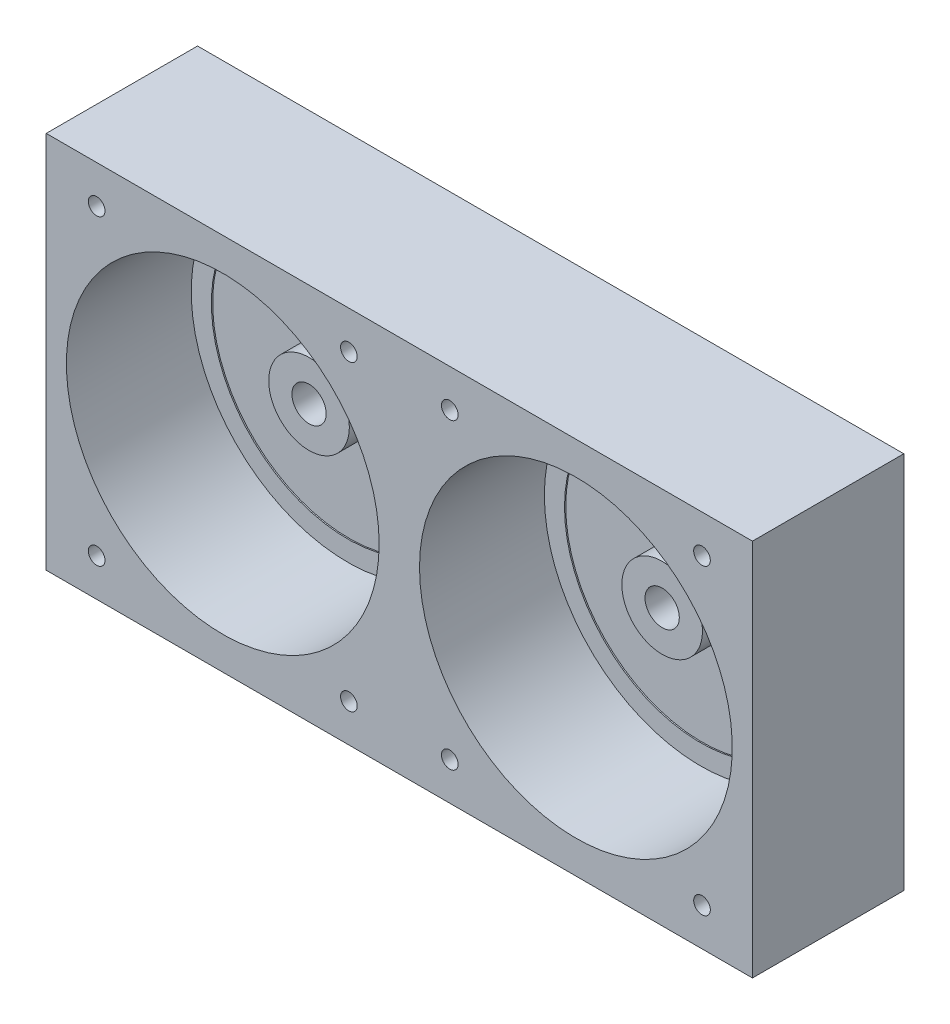
ISO-10303-21;
HEADER;
FILE_DESCRIPTION(('STEP AP214'),'2;1');
FILE_NAME('part.step','',(''),(''),'','','');
FILE_SCHEMA(('AUTOMOTIVE_DESIGN { 1 0 10303 214 1 1 1 1 }'));
ENDSEC;
DATA;
#1=APPLICATION_CONTEXT('core data for automotive mechanical design processes');
#2=APPLICATION_PROTOCOL_DEFINITION('international standard','automotive_design',2000,#1);
#3=PRODUCT_CONTEXT('',#1,'mechanical');
#4=PRODUCT('Part','Part','',(#3));
#5=PRODUCT_RELATED_PRODUCT_CATEGORY('part','',(#4));
#6=PRODUCT_DEFINITION_FORMATION('','',#4);
#7=PRODUCT_DEFINITION_CONTEXT('part definition',#1,'design');
#8=PRODUCT_DEFINITION('design','',#6,#7);
#9=PRODUCT_DEFINITION_SHAPE('','',#8);
#10=(LENGTH_UNIT() NAMED_UNIT(*) SI_UNIT(.MILLI.,.METRE.));
#11=(NAMED_UNIT(*) PLANE_ANGLE_UNIT() SI_UNIT($,.RADIAN.));
#12=(NAMED_UNIT(*) SI_UNIT($,.STERADIAN.) SOLID_ANGLE_UNIT());
#13=UNCERTAINTY_MEASURE_WITH_UNIT(LENGTH_MEASURE(1.E-05),#10,'distance_accuracy_value','');
#14=(GEOMETRIC_REPRESENTATION_CONTEXT(3) GLOBAL_UNCERTAINTY_ASSIGNED_CONTEXT((#13)) GLOBAL_UNIT_ASSIGNED_CONTEXT((#10,
#11,#12)) REPRESENTATION_CONTEXT('',''));
#15=CARTESIAN_POINT('',(0.,0.,0.));
#16=DIRECTION('',(0.,0.,1.));
#17=DIRECTION('',(1.,0.,0.));
#18=AXIS2_PLACEMENT_3D('',#15,#16,#17);
#19=CARTESIAN_POINT('',(105.,37.5,5.));
#20=DIRECTION('',(0.,0.,-1.));
#21=DIRECTION('',(-1.,0.,0.));
#22=AXIS2_PLACEMENT_3D('',#19,#20,#21);
#23=PLANE('',#22);
#24=CARTESIAN_POINT('',(105.,37.5,5.));
#25=DIRECTION('',(0.,0.,1.));
#26=DIRECTION('',(-1.,0.,0.));
#27=AXIS2_PLACEMENT_3D('',#24,#25,#26);
#28=CIRCLE('',#27,27.01);
#29=CARTESIAN_POINT('',(77.99,37.5,5.));
#30=VERTEX_POINT('',#29);
#31=EDGE_CURVE('E306',#30,#30,#28,.T.);
#32=ORIENTED_EDGE('',*,*,#31,.T.);
#33=EDGE_LOOP('',(#32));
#34=FACE_BOUND('',#33,.T.);
#35=CARTESIAN_POINT('',(105.,37.5,5.));
#36=DIRECTION('',(0.,0.,-1.));
#37=DIRECTION('',(-1.,0.,0.));
#38=AXIS2_PLACEMENT_3D('',#35,#36,#37);
#39=CIRCLE('',#38,7.99);
#40=CARTESIAN_POINT('',(97.01,37.5,5.));
#41=VERTEX_POINT('',#40);
#42=EDGE_CURVE('E11',#41,#41,#39,.F.);
#43=ORIENTED_EDGE('',*,*,#42,.F.);
#44=EDGE_LOOP('',(#43));
#45=FACE_BOUND('',#44,.T.);
#46=ADVANCED_FACE('F32',(#34,#45),#23,.F.);
#47=CARTESIAN_POINT('',(35.,37.5,5.));
#48=DIRECTION('',(0.,0.,1.));
#49=DIRECTION('',(1.,0.,0.));
#50=AXIS2_PLACEMENT_3D('',#47,#48,#49);
#51=PLANE('',#50);
#52=CARTESIAN_POINT('',(35.,37.5,5.));
#53=DIRECTION('',(0.,0.,1.));
#54=DIRECTION('',(1.,0.,0.));
#55=AXIS2_PLACEMENT_3D('',#52,#53,#54);
#56=CIRCLE('',#55,27.01);
#57=CARTESIAN_POINT('',(62.01,37.5,5.));
#58=VERTEX_POINT('',#57);
#59=EDGE_CURVE('E110',#58,#58,#56,.F.);
#60=ORIENTED_EDGE('',*,*,#59,.F.);
#61=EDGE_LOOP('',(#60));
#62=FACE_BOUND('',#61,.T.);
#63=CARTESIAN_POINT('',(35.,37.5,5.));
#64=DIRECTION('',(0.,0.,1.));
#65=DIRECTION('',(1.,0.,0.));
#66=AXIS2_PLACEMENT_3D('',#63,#64,#65);
#67=CIRCLE('',#66,7.98999999999999);
#68=CARTESIAN_POINT('',(42.99,37.5,5.));
#69=VERTEX_POINT('',#68);
#70=EDGE_CURVE('E302',#69,#69,#67,.T.);
#71=ORIENTED_EDGE('',*,*,#70,.F.);
#72=EDGE_LOOP('',(#71));
#73=FACE_BOUND('',#72,.T.);
#74=ADVANCED_FACE('F120',(#62,#73),#51,.T.);
#75=CARTESIAN_POINT('',(105.,37.5,5.));
#76=DIRECTION('',(0.,0.,1.));
#77=DIRECTION('',(1.,0.,0.));
#78=AXIS2_PLACEMENT_3D('',#75,#76,#77);
#79=CYLINDRICAL_SURFACE('',#78,31.);
#80=CARTESIAN_POINT('',(105.,37.5,30.));
#81=DIRECTION('',(0.,0.,1.));
#82=DIRECTION('',(-1.,0.,0.));
#83=AXIS2_PLACEMENT_3D('',#80,#81,#82);
#84=CIRCLE('',#83,31.);
#85=CARTESIAN_POINT('',(74.,37.5,30.));
#86=VERTEX_POINT('',#85);
#87=EDGE_CURVE('E325',#86,#86,#84,.T.);
#88=ORIENTED_EDGE('',*,*,#87,.T.);
#89=EDGE_LOOP('',(#88));
#90=FACE_BOUND('',#89,.T.);
#91=CARTESIAN_POINT('',(105.,37.5,5.25));
#92=DIRECTION('',(0.,0.,-1.));
#93=DIRECTION('',(-1.,0.,0.));
#94=AXIS2_PLACEMENT_3D('',#91,#92,#93);
#95=CIRCLE('',#94,31.);
#96=CARTESIAN_POINT('',(74.,37.5,5.25));
#97=VERTEX_POINT('',#96);
#98=EDGE_CURVE('E41',#97,#97,#95,.F.);
#99=ORIENTED_EDGE('',*,*,#98,.F.);
#100=EDGE_LOOP('',(#99));
#101=FACE_BOUND('',#100,.T.);
#102=ADVANCED_FACE('F118',(#90,#101),#79,.F.);
#103=CARTESIAN_POINT('',(0.,0.,30.));
#104=DIRECTION('',(1.,0.,0.));
#105=DIRECTION('',(0.,0.,-1.));
#106=AXIS2_PLACEMENT_3D('',#103,#104,#105);
#107=PLANE('',#106);
#108=DIRECTION('',(0.,-1.,0.));
#109=VECTOR('',#108,1.);
#110=CARTESIAN_POINT('',(0.,0.,0.));
#111=LINE('',#110,#109);
#112=CARTESIAN_POINT('',(0.,75.,0.));
#113=VERTEX_POINT('',#112);
#114=CARTESIAN_POINT('',(0.,0.,0.));
#115=VERTEX_POINT('',#114);
#116=EDGE_CURVE('E100',#113,#115,#111,.T.);
#117=ORIENTED_EDGE('',*,*,#116,.T.);
#118=DIRECTION('',(0.,0.,-1.));
#119=VECTOR('',#118,1.);
#120=CARTESIAN_POINT('',(0.,0.,30.));
#121=LINE('',#120,#119);
#122=CARTESIAN_POINT('',(0.,0.,30.));
#123=VERTEX_POINT('',#122);
#124=EDGE_CURVE('E91',#123,#115,#121,.T.);
#125=ORIENTED_EDGE('',*,*,#124,.F.);
#126=DIRECTION('',(0.,-1.,0.));
#127=VECTOR('',#126,1.);
#128=CARTESIAN_POINT('',(0.,0.,30.));
#129=LINE('',#128,#127);
#130=CARTESIAN_POINT('',(0.,75.,30.));
#131=VERTEX_POINT('',#130);
#132=EDGE_CURVE('E85',#131,#123,#129,.T.);
#133=ORIENTED_EDGE('',*,*,#132,.F.);
#134=DIRECTION('',(0.,0.,-1.));
#135=VECTOR('',#134,1.);
#136=CARTESIAN_POINT('',(0.,75.,30.));
#137=LINE('',#136,#135);
#138=EDGE_CURVE('E96',#131,#113,#137,.T.);
#139=ORIENTED_EDGE('',*,*,#138,.T.);
#140=EDGE_LOOP('',(#117,#125,#133,#139));
#141=FACE_BOUND('',#140,.T.);
#142=ADVANCED_FACE('F34',(#141),#107,.F.);
#143=CARTESIAN_POINT('',(0.,0.,30.));
#144=DIRECTION('',(0.,1.,0.));
#145=DIRECTION('',(0.,0.,1.));
#146=AXIS2_PLACEMENT_3D('',#143,#144,#145);
#147=PLANE('',#146);
#148=DIRECTION('',(1.,0.,0.));
#149=VECTOR('',#148,1.);
#150=CARTESIAN_POINT('',(0.,0.,0.));
#151=LINE('',#150,#149);
#152=CARTESIAN_POINT('',(140.,0.,0.));
#153=VERTEX_POINT('',#152);
#154=EDGE_CURVE('E90',#115,#153,#151,.T.);
#155=ORIENTED_EDGE('',*,*,#154,.T.);
#156=DIRECTION('',(0.,0.,-1.));
#157=VECTOR('',#156,1.);
#158=CARTESIAN_POINT('',(140.,0.,30.));
#159=LINE('',#158,#157);
#160=CARTESIAN_POINT('',(140.,0.,30.));
#161=VERTEX_POINT('',#160);
#162=EDGE_CURVE('E88',#161,#153,#159,.T.);
#163=ORIENTED_EDGE('',*,*,#162,.F.);
#164=DIRECTION('',(1.,0.,0.));
#165=VECTOR('',#164,1.);
#166=CARTESIAN_POINT('',(0.,0.,30.));
#167=LINE('',#166,#165);
#168=EDGE_CURVE('E80',#123,#161,#167,.T.);
#169=ORIENTED_EDGE('',*,*,#168,.F.);
#170=ORIENTED_EDGE('',*,*,#124,.T.);
#171=EDGE_LOOP('',(#155,#163,#169,#170));
#172=FACE_BOUND('',#171,.T.);
#173=ADVANCED_FACE('F89',(#172),#147,.F.);
#174=CARTESIAN_POINT('',(140.,0.,30.));
#175=DIRECTION('',(-1.,0.,0.));
#176=DIRECTION('',(0.,0.,1.));
#177=AXIS2_PLACEMENT_3D('',#174,#175,#176);
#178=PLANE('',#177);
#179=DIRECTION('',(0.,1.,0.));
#180=VECTOR('',#179,1.);
#181=CARTESIAN_POINT('',(140.,0.,0.));
#182=LINE('',#181,#180);
#183=CARTESIAN_POINT('',(140.,75.,0.));
#184=VERTEX_POINT('',#183);
#185=EDGE_CURVE('E66',#153,#184,#182,.T.);
#186=ORIENTED_EDGE('',*,*,#185,.T.);
#187=DIRECTION('',(0.,0.,-1.));
#188=VECTOR('',#187,1.);
#189=CARTESIAN_POINT('',(140.,75.,30.));
#190=LINE('',#189,#188);
#191=CARTESIAN_POINT('',(140.,75.,30.));
#192=VERTEX_POINT('',#191);
#193=EDGE_CURVE('E92',#192,#184,#190,.T.);
#194=ORIENTED_EDGE('',*,*,#193,.F.);
#195=DIRECTION('',(0.,1.,0.));
#196=VECTOR('',#195,1.);
#197=CARTESIAN_POINT('',(140.,0.,30.));
#198=LINE('',#197,#196);
#199=EDGE_CURVE('E83',#161,#192,#198,.T.);
#200=ORIENTED_EDGE('',*,*,#199,.F.);
#201=ORIENTED_EDGE('',*,*,#162,.T.);
#202=EDGE_LOOP('',(#186,#194,#200,#201));
#203=FACE_BOUND('',#202,.T.);
#204=ADVANCED_FACE('F94',(#203),#178,.F.);
#205=CARTESIAN_POINT('',(0.,75.,30.));
#206=DIRECTION('',(0.,-1.,0.));
#207=DIRECTION('',(0.,0.,-1.));
#208=AXIS2_PLACEMENT_3D('',#205,#206,#207);
#209=PLANE('',#208);
#210=DIRECTION('',(-1.,0.,0.));
#211=VECTOR('',#210,1.);
#212=CARTESIAN_POINT('',(0.,75.,0.));
#213=LINE('',#212,#211);
#214=EDGE_CURVE('E72',#184,#113,#213,.T.);
#215=ORIENTED_EDGE('',*,*,#214,.T.);
#216=ORIENTED_EDGE('',*,*,#138,.F.);
#217=DIRECTION('',(-1.,0.,0.));
#218=VECTOR('',#217,1.);
#219=CARTESIAN_POINT('',(0.,75.,30.));
#220=LINE('',#219,#218);
#221=EDGE_CURVE('E49',#192,#131,#220,.T.);
#222=ORIENTED_EDGE('',*,*,#221,.F.);
#223=ORIENTED_EDGE('',*,*,#193,.T.);
#224=EDGE_LOOP('',(#215,#216,#222,#223));
#225=FACE_BOUND('',#224,.T.);
#226=ADVANCED_FACE('F333',(#225),#209,.F.);
#227=CARTESIAN_POINT('',(0.,0.,30.));
#228=DIRECTION('',(0.,0.,-1.));
#229=DIRECTION('',(-1.,0.,0.));
#230=AXIS2_PLACEMENT_3D('',#227,#228,#229);
#231=PLANE('',#230);
#232=CARTESIAN_POINT('',(10.,67.5,30.));
#233=DIRECTION('',(0.,0.,1.));
#234=DIRECTION('',(1.,0.,0.));
#235=AXIS2_PLACEMENT_3D('',#232,#233,#234);
#236=CIRCLE('',#235,1.65);
#237=CARTESIAN_POINT('',(11.65,67.5,30.));
#238=VERTEX_POINT('',#237);
#239=EDGE_CURVE('E247',#238,#238,#236,.T.);
#240=ORIENTED_EDGE('',*,*,#239,.F.);
#241=EDGE_LOOP('',(#240));
#242=FACE_BOUND('',#241,.T.);
#243=CARTESIAN_POINT('',(10.,7.49999999999999,30.));
#244=DIRECTION('',(0.,0.,1.));
#245=DIRECTION('',(-1.,0.,0.));
#246=AXIS2_PLACEMENT_3D('',#243,#244,#245);
#247=CIRCLE('',#246,1.65);
#248=CARTESIAN_POINT('',(8.35000000000001,7.49999999999999,30.));
#249=VERTEX_POINT('',#248);
#250=EDGE_CURVE('E258',#249,#249,#247,.T.);
#251=ORIENTED_EDGE('',*,*,#250,.F.);
#252=EDGE_LOOP('',(#251));
#253=FACE_BOUND('',#252,.T.);
#254=CARTESIAN_POINT('',(60.,7.49999999999999,30.));
#255=DIRECTION('',(0.,0.,1.));
#256=DIRECTION('',(-1.,0.,0.));
#257=AXIS2_PLACEMENT_3D('',#254,#255,#256);
#258=CIRCLE('',#257,1.65);
#259=CARTESIAN_POINT('',(58.35,7.49999999999999,30.));
#260=VERTEX_POINT('',#259);
#261=EDGE_CURVE('E264',#260,#260,#258,.T.);
#262=ORIENTED_EDGE('',*,*,#261,.F.);
#263=EDGE_LOOP('',(#262));
#264=FACE_BOUND('',#263,.T.);
#265=CARTESIAN_POINT('',(80.,7.49999999999999,30.));
#266=DIRECTION('',(0.,0.,1.));
#267=DIRECTION('',(1.,0.,0.));
#268=AXIS2_PLACEMENT_3D('',#265,#266,#267);
#269=CIRCLE('',#268,1.65);
#270=CARTESIAN_POINT('',(81.65,7.49999999999999,30.));
#271=VERTEX_POINT('',#270);
#272=EDGE_CURVE('E270',#271,#271,#269,.T.);
#273=ORIENTED_EDGE('',*,*,#272,.F.);
#274=EDGE_LOOP('',(#273));
#275=FACE_BOUND('',#274,.T.);
#276=CARTESIAN_POINT('',(130.,7.49999999999999,30.));
#277=DIRECTION('',(0.,0.,1.));
#278=DIRECTION('',(1.,0.,0.));
#279=AXIS2_PLACEMENT_3D('',#276,#277,#278);
#280=CIRCLE('',#279,1.65000000000002);
#281=CARTESIAN_POINT('',(131.65,7.49999999999999,30.));
#282=VERTEX_POINT('',#281);
#283=EDGE_CURVE('E276',#282,#282,#280,.T.);
#284=ORIENTED_EDGE('',*,*,#283,.F.);
#285=EDGE_LOOP('',(#284));
#286=FACE_BOUND('',#285,.T.);
#287=CARTESIAN_POINT('',(130.,67.5,30.));
#288=DIRECTION('',(0.,0.,1.));
#289=DIRECTION('',(-1.,0.,0.));
#290=AXIS2_PLACEMENT_3D('',#287,#288,#289);
#291=CIRCLE('',#290,1.65000000000002);
#292=CARTESIAN_POINT('',(128.35,67.5,30.));
#293=VERTEX_POINT('',#292);
#294=EDGE_CURVE('E282',#293,#293,#291,.T.);
#295=ORIENTED_EDGE('',*,*,#294,.F.);
#296=EDGE_LOOP('',(#295));
#297=FACE_BOUND('',#296,.T.);
#298=CARTESIAN_POINT('',(80.,67.5,30.));
#299=DIRECTION('',(0.,0.,1.));
#300=DIRECTION('',(-1.,0.,0.));
#301=AXIS2_PLACEMENT_3D('',#298,#299,#300);
#302=CIRCLE('',#301,1.65);
#303=CARTESIAN_POINT('',(78.35,67.5,30.));
#304=VERTEX_POINT('',#303);
#305=EDGE_CURVE('E288',#304,#304,#302,.T.);
#306=ORIENTED_EDGE('',*,*,#305,.F.);
#307=EDGE_LOOP('',(#306));
#308=FACE_BOUND('',#307,.T.);
#309=CARTESIAN_POINT('',(60.,67.5,30.));
#310=DIRECTION('',(0.,0.,1.));
#311=DIRECTION('',(1.,0.,0.));
#312=AXIS2_PLACEMENT_3D('',#309,#310,#311);
#313=CIRCLE('',#312,1.65);
#314=CARTESIAN_POINT('',(61.65,67.5,30.));
#315=VERTEX_POINT('',#314);
#316=EDGE_CURVE('E246',#315,#315,#313,.T.);
#317=ORIENTED_EDGE('',*,*,#316,.F.);
#318=EDGE_LOOP('',(#317));
#319=FACE_BOUND('',#318,.T.);
#320=ORIENTED_EDGE('',*,*,#87,.F.);
#321=EDGE_LOOP('',(#320));
#322=FACE_BOUND('',#321,.T.);
#323=CARTESIAN_POINT('',(35.,37.5,30.));
#324=DIRECTION('',(0.,0.,1.));
#325=DIRECTION('',(1.,0.,0.));
#326=AXIS2_PLACEMENT_3D('',#323,#324,#325);
#327=CIRCLE('',#326,31.);
#328=CARTESIAN_POINT('',(66.,37.5,30.));
#329=VERTEX_POINT('',#328);
#330=EDGE_CURVE('E103',#329,#329,#327,.T.);
#331=ORIENTED_EDGE('',*,*,#330,.F.);
#332=EDGE_LOOP('',(#331));
#333=FACE_BOUND('',#332,.T.);
#334=ORIENTED_EDGE('',*,*,#132,.T.);
#335=ORIENTED_EDGE('',*,*,#168,.T.);
#336=ORIENTED_EDGE('',*,*,#199,.T.);
#337=ORIENTED_EDGE('',*,*,#221,.T.);
#338=EDGE_LOOP('',(#334,#335,#336,#337));
#339=FACE_BOUND('',#338,.T.);
#340=ADVANCED_FACE('F81',(#242,#253,#264,#275,#286,#297,#308,#319,#322,#333,#339),#231,.F.);
#341=CARTESIAN_POINT('',(0.,0.,0.));
#342=DIRECTION('',(0.,0.,-1.));
#343=DIRECTION('',(-1.,0.,0.));
#344=AXIS2_PLACEMENT_3D('',#341,#342,#343);
#345=PLANE('',#344);
#346=CARTESIAN_POINT('',(105.,37.5,0.));
#347=DIRECTION('',(0.,0.,1.));
#348=DIRECTION('',(-1.,0.,0.));
#349=AXIS2_PLACEMENT_3D('',#346,#347,#348);
#350=CIRCLE('',#349,3.4);
#351=CARTESIAN_POINT('',(101.6,37.5,0.));
#352=VERTEX_POINT('',#351);
#353=EDGE_CURVE('E319',#352,#352,#350,.T.);
#354=ORIENTED_EDGE('',*,*,#353,.T.);
#355=EDGE_LOOP('',(#354));
#356=FACE_BOUND('',#355,.T.);
#357=CARTESIAN_POINT('',(35.,37.5,0.));
#358=DIRECTION('',(0.,0.,1.));
#359=DIRECTION('',(1.,0.,0.));
#360=AXIS2_PLACEMENT_3D('',#357,#358,#359);
#361=CIRCLE('',#360,3.4);
#362=CARTESIAN_POINT('',(38.4,37.5,0.));
#363=VERTEX_POINT('',#362);
#364=EDGE_CURVE('E322',#363,#363,#361,.T.);
#365=ORIENTED_EDGE('',*,*,#364,.T.);
#366=EDGE_LOOP('',(#365));
#367=FACE_BOUND('',#366,.T.);
#368=ORIENTED_EDGE('',*,*,#116,.F.);
#369=ORIENTED_EDGE('',*,*,#214,.F.);
#370=ORIENTED_EDGE('',*,*,#185,.F.);
#371=ORIENTED_EDGE('',*,*,#154,.F.);
#372=EDGE_LOOP('',(#368,#369,#370,#371));
#373=FACE_BOUND('',#372,.T.);
#374=ADVANCED_FACE('F332',(#356,#367,#373),#345,.T.);
#375=CARTESIAN_POINT('',(35.,37.5,5.));
#376=DIRECTION('',(0.,0.,1.));
#377=DIRECTION('',(1.,0.,0.));
#378=AXIS2_PLACEMENT_3D('',#375,#376,#377);
#379=CYLINDRICAL_SURFACE('',#378,31.);
#380=CARTESIAN_POINT('',(35.,37.5,5.25));
#381=DIRECTION('',(0.,0.,1.));
#382=DIRECTION('',(1.,0.,0.));
#383=AXIS2_PLACEMENT_3D('',#380,#381,#382);
#384=CIRCLE('',#383,31.);
#385=CARTESIAN_POINT('',(66.,37.5,5.25));
#386=VERTEX_POINT('',#385);
#387=EDGE_CURVE('E316',#386,#386,#384,.T.);
#388=ORIENTED_EDGE('',*,*,#387,.F.);
#389=EDGE_LOOP('',(#388));
#390=FACE_BOUND('',#389,.T.);
#391=ORIENTED_EDGE('',*,*,#330,.T.);
#392=EDGE_LOOP('',(#391));
#393=FACE_BOUND('',#392,.T.);
#394=ADVANCED_FACE('F143',(#390,#393),#379,.F.);
#395=CARTESIAN_POINT('',(35.,37.5,0.));
#396=DIRECTION('',(0.,0.,1.));
#397=DIRECTION('',(1.,0.,0.));
#398=AXIS2_PLACEMENT_3D('',#395,#396,#397);
#399=CYLINDRICAL_SURFACE('',#398,3.4);
#400=ORIENTED_EDGE('',*,*,#364,.F.);
#401=EDGE_LOOP('',(#400));
#402=FACE_BOUND('',#401,.T.);
#403=CARTESIAN_POINT('',(35.,37.5,12.9));
#404=DIRECTION('',(0.,0.,1.));
#405=DIRECTION('',(1.,0.,0.));
#406=AXIS2_PLACEMENT_3D('',#403,#404,#405);
#407=CIRCLE('',#406,3.4);
#408=CARTESIAN_POINT('',(38.4,37.5,12.9));
#409=VERTEX_POINT('',#408);
#410=EDGE_CURVE('E299',#409,#409,#407,.T.);
#411=ORIENTED_EDGE('',*,*,#410,.T.);
#412=EDGE_LOOP('',(#411));
#413=FACE_BOUND('',#412,.T.);
#414=ADVANCED_FACE('F139',(#402,#413),#399,.F.);
#415=CARTESIAN_POINT('',(105.,37.5,0.));
#416=DIRECTION('',(0.,0.,1.));
#417=DIRECTION('',(1.,0.,0.));
#418=AXIS2_PLACEMENT_3D('',#415,#416,#417);
#419=CYLINDRICAL_SURFACE('',#418,3.4);
#420=ORIENTED_EDGE('',*,*,#353,.F.);
#421=EDGE_LOOP('',(#420));
#422=FACE_BOUND('',#421,.T.);
#423=CARTESIAN_POINT('',(105.,37.5,12.9));
#424=DIRECTION('',(0.,0.,1.));
#425=DIRECTION('',(1.,0.,0.));
#426=AXIS2_PLACEMENT_3D('',#423,#424,#425);
#427=CIRCLE('',#426,3.4);
#428=CARTESIAN_POINT('',(108.4,37.5,12.9));
#429=VERTEX_POINT('',#428);
#430=EDGE_CURVE('E292',#429,#429,#427,.T.);
#431=ORIENTED_EDGE('',*,*,#430,.T.);
#432=EDGE_LOOP('',(#431));
#433=FACE_BOUND('',#432,.T.);
#434=ADVANCED_FACE('F142',(#422,#433),#419,.F.);
#435=CARTESIAN_POINT('',(35.,37.5,5.25));
#436=DIRECTION('',(0.,0.,1.));
#437=DIRECTION('',(1.,0.,0.));
#438=AXIS2_PLACEMENT_3D('',#435,#436,#437);
#439=PLANE('',#438);
#440=ORIENTED_EDGE('',*,*,#387,.T.);
#441=EDGE_LOOP('',(#440));
#442=FACE_BOUND('',#441,.T.);
#443=CARTESIAN_POINT('',(35.,37.5,5.25));
#444=DIRECTION('',(0.,0.,1.));
#445=DIRECTION('',(1.,0.,0.));
#446=AXIS2_PLACEMENT_3D('',#443,#444,#445);
#447=CIRCLE('',#446,27.01);
#448=CARTESIAN_POINT('',(62.01,37.5,5.25));
#449=VERTEX_POINT('',#448);
#450=EDGE_CURVE('E312',#449,#449,#447,.T.);
#451=ORIENTED_EDGE('',*,*,#450,.F.);
#452=EDGE_LOOP('',(#451));
#453=FACE_BOUND('',#452,.T.);
#454=ADVANCED_FACE('F147',(#442,#453),#439,.T.);
#455=CARTESIAN_POINT('',(35.,37.5,5.25));
#456=DIRECTION('',(0.,0.,-1.));
#457=DIRECTION('',(-1.,0.,0.));
#458=AXIS2_PLACEMENT_3D('',#455,#456,#457);
#459=CYLINDRICAL_SURFACE('',#458,27.01);
#460=ORIENTED_EDGE('',*,*,#450,.T.);
#461=EDGE_LOOP('',(#460));
#462=FACE_BOUND('',#461,.T.);
#463=ORIENTED_EDGE('',*,*,#59,.T.);
#464=EDGE_LOOP('',(#463));
#465=FACE_BOUND('',#464,.T.);
#466=ADVANCED_FACE('F151',(#462,#465),#459,.F.);
#467=CARTESIAN_POINT('',(105.,37.5,5.25));
#468=DIRECTION('',(0.,0.,-1.));
#469=DIRECTION('',(-1.,0.,0.));
#470=AXIS2_PLACEMENT_3D('',#467,#468,#469);
#471=PLANE('',#470);
#472=ORIENTED_EDGE('',*,*,#98,.T.);
#473=EDGE_LOOP('',(#472));
#474=FACE_BOUND('',#473,.T.);
#475=CARTESIAN_POINT('',(105.,37.5,5.25));
#476=DIRECTION('',(0.,0.,1.));
#477=DIRECTION('',(-1.,0.,0.));
#478=AXIS2_PLACEMENT_3D('',#475,#476,#477);
#479=CIRCLE('',#478,27.01);
#480=CARTESIAN_POINT('',(77.99,37.5,5.25));
#481=VERTEX_POINT('',#480);
#482=EDGE_CURVE('E309',#481,#481,#479,.T.);
#483=ORIENTED_EDGE('',*,*,#482,.F.);
#484=EDGE_LOOP('',(#483));
#485=FACE_BOUND('',#484,.T.);
#486=ADVANCED_FACE('F115',(#474,#485),#471,.F.);
#487=CARTESIAN_POINT('',(105.,37.5,5.25));
#488=DIRECTION('',(0.,0.,-1.));
#489=DIRECTION('',(-1.,0.,0.));
#490=AXIS2_PLACEMENT_3D('',#487,#488,#489);
#491=CYLINDRICAL_SURFACE('',#490,27.01);
#492=ORIENTED_EDGE('',*,*,#482,.T.);
#493=EDGE_LOOP('',(#492));
#494=FACE_BOUND('',#493,.T.);
#495=ORIENTED_EDGE('',*,*,#31,.F.);
#496=EDGE_LOOP('',(#495));
#497=FACE_BOUND('',#496,.T.);
#498=ADVANCED_FACE('F158',(#494,#497),#491,.F.);
#499=CARTESIAN_POINT('',(35.,37.5,12.9));
#500=DIRECTION('',(0.,0.,1.));
#501=DIRECTION('',(1.,0.,0.));
#502=AXIS2_PLACEMENT_3D('',#499,#500,#501);
#503=PLANE('',#502);
#504=CARTESIAN_POINT('',(35.,37.5,12.9));
#505=DIRECTION('',(0.,0.,1.));
#506=DIRECTION('',(1.,0.,0.));
#507=AXIS2_PLACEMENT_3D('',#504,#505,#506);
#508=CIRCLE('',#507,7.98999999999999);
#509=CARTESIAN_POINT('',(42.99,37.5,12.9));
#510=VERTEX_POINT('',#509);
#511=EDGE_CURVE('E303',#510,#510,#508,.T.);
#512=ORIENTED_EDGE('',*,*,#511,.T.);
#513=EDGE_LOOP('',(#512));
#514=FACE_BOUND('',#513,.T.);
#515=ORIENTED_EDGE('',*,*,#410,.F.);
#516=EDGE_LOOP('',(#515));
#517=FACE_BOUND('',#516,.T.);
#518=ADVANCED_FACE('F161',(#514,#517),#503,.T.);
#519=CARTESIAN_POINT('',(35.,37.5,12.9));
#520=DIRECTION('',(0.,0.,-1.));
#521=DIRECTION('',(-1.,0.,0.));
#522=AXIS2_PLACEMENT_3D('',#519,#520,#521);
#523=CYLINDRICAL_SURFACE('',#522,7.98999999999999);
#524=ORIENTED_EDGE('',*,*,#511,.F.);
#525=EDGE_LOOP('',(#524));
#526=FACE_BOUND('',#525,.T.);
#527=ORIENTED_EDGE('',*,*,#70,.T.);
#528=EDGE_LOOP('',(#527));
#529=FACE_BOUND('',#528,.T.);
#530=ADVANCED_FACE('F163',(#526,#529),#523,.T.);
#531=CARTESIAN_POINT('',(105.,37.5,12.9));
#532=DIRECTION('',(0.,0.,1.));
#533=DIRECTION('',(1.,0.,0.));
#534=AXIS2_PLACEMENT_3D('',#531,#532,#533);
#535=PLANE('',#534);
#536=CARTESIAN_POINT('',(105.,37.5,12.9));
#537=DIRECTION('',(0.,0.,1.));
#538=DIRECTION('',(1.,0.,0.));
#539=AXIS2_PLACEMENT_3D('',#536,#537,#538);
#540=CIRCLE('',#539,7.99);
#541=CARTESIAN_POINT('',(112.99,37.5,12.9));
#542=VERTEX_POINT('',#541);
#543=EDGE_CURVE('E296',#542,#542,#540,.T.);
#544=ORIENTED_EDGE('',*,*,#543,.T.);
#545=EDGE_LOOP('',(#544));
#546=FACE_BOUND('',#545,.T.);
#547=ORIENTED_EDGE('',*,*,#430,.F.);
#548=EDGE_LOOP('',(#547));
#549=FACE_BOUND('',#548,.T.);
#550=ADVANCED_FACE('F166',(#546,#549),#535,.T.);
#551=CARTESIAN_POINT('',(105.,37.5,12.9));
#552=DIRECTION('',(0.,0.,-1.));
#553=DIRECTION('',(-1.,0.,0.));
#554=AXIS2_PLACEMENT_3D('',#551,#552,#553);
#555=CYLINDRICAL_SURFACE('',#554,7.99);
#556=ORIENTED_EDGE('',*,*,#543,.F.);
#557=EDGE_LOOP('',(#556));
#558=FACE_BOUND('',#557,.T.);
#559=ORIENTED_EDGE('',*,*,#42,.T.);
#560=EDGE_LOOP('',(#559));
#561=FACE_BOUND('',#560,.T.);
#562=ADVANCED_FACE('F171',(#558,#561),#555,.T.);
#563=CARTESIAN_POINT('',(60.,67.5,10.));
#564=DIRECTION('',(0.,0.,1.));
#565=DIRECTION('',(1.,0.,0.));
#566=AXIS2_PLACEMENT_3D('',#563,#564,#565);
#567=CYLINDRICAL_SURFACE('',#566,1.65);
#568=CARTESIAN_POINT('',(60.,67.5,10.));
#569=DIRECTION('',(0.,0.,1.));
#570=DIRECTION('',(1.,0.,0.));
#571=AXIS2_PLACEMENT_3D('',#568,#569,#570);
#572=CIRCLE('',#571,1.65);
#573=CARTESIAN_POINT('',(61.65,67.5,10.));
#574=VERTEX_POINT('',#573);
#575=EDGE_CURVE('E250',#574,#574,#572,.T.);
#576=ORIENTED_EDGE('',*,*,#575,.F.);
#577=EDGE_LOOP('',(#576));
#578=FACE_BOUND('',#577,.T.);
#579=ORIENTED_EDGE('',*,*,#316,.T.);
#580=EDGE_LOOP('',(#579));
#581=FACE_BOUND('',#580,.T.);
#582=ADVANCED_FACE('F174',(#578,#581),#567,.F.);
#583=CARTESIAN_POINT('',(60.,67.5,10.));
#584=DIRECTION('',(0.,0.,1.));
#585=DIRECTION('',(1.,0.,0.));
#586=AXIS2_PLACEMENT_3D('',#583,#584,#585);
#587=PLANE('',#586);
#588=ORIENTED_EDGE('',*,*,#575,.T.);
#589=EDGE_LOOP('',(#588));
#590=FACE_BOUND('',#589,.T.);
#591=ADVANCED_FACE('F181',(#590),#587,.T.);
#592=CARTESIAN_POINT('',(80.,67.5,10.));
#593=DIRECTION('',(0.,0.,1.));
#594=DIRECTION('',(1.,0.,0.));
#595=AXIS2_PLACEMENT_3D('',#592,#593,#594);
#596=CYLINDRICAL_SURFACE('',#595,1.65);
#597=CARTESIAN_POINT('',(80.,67.5,10.));
#598=DIRECTION('',(0.,0.,1.));
#599=DIRECTION('',(-1.,0.,0.));
#600=AXIS2_PLACEMENT_3D('',#597,#598,#599);
#601=CIRCLE('',#600,1.65);
#602=CARTESIAN_POINT('',(78.35,67.5,10.));
#603=VERTEX_POINT('',#602);
#604=EDGE_CURVE('E285',#603,#603,#601,.T.);
#605=ORIENTED_EDGE('',*,*,#604,.F.);
#606=EDGE_LOOP('',(#605));
#607=FACE_BOUND('',#606,.T.);
#608=ORIENTED_EDGE('',*,*,#305,.T.);
#609=EDGE_LOOP('',(#608));
#610=FACE_BOUND('',#609,.T.);
#611=ADVANCED_FACE('F185',(#607,#610),#596,.F.);
#612=CARTESIAN_POINT('',(80.,67.5,10.));
#613=DIRECTION('',(0.,0.,-1.));
#614=DIRECTION('',(-1.,0.,0.));
#615=AXIS2_PLACEMENT_3D('',#612,#613,#614);
#616=PLANE('',#615);
#617=ORIENTED_EDGE('',*,*,#604,.T.);
#618=EDGE_LOOP('',(#617));
#619=FACE_BOUND('',#618,.T.);
#620=ADVANCED_FACE('F189',(#619),#616,.F.);
#621=CARTESIAN_POINT('',(130.,67.5,10.));
#622=DIRECTION('',(0.,0.,1.));
#623=DIRECTION('',(1.,0.,0.));
#624=AXIS2_PLACEMENT_3D('',#621,#622,#623);
#625=CYLINDRICAL_SURFACE('',#624,1.65000000000002);
#626=CARTESIAN_POINT('',(130.,67.5,10.));
#627=DIRECTION('',(0.,0.,1.));
#628=DIRECTION('',(-1.,0.,0.));
#629=AXIS2_PLACEMENT_3D('',#626,#627,#628);
#630=CIRCLE('',#629,1.65000000000002);
#631=CARTESIAN_POINT('',(128.35,67.5,10.));
#632=VERTEX_POINT('',#631);
#633=EDGE_CURVE('E279',#632,#632,#630,.T.);
#634=ORIENTED_EDGE('',*,*,#633,.F.);
#635=EDGE_LOOP('',(#634));
#636=FACE_BOUND('',#635,.T.);
#637=ORIENTED_EDGE('',*,*,#294,.T.);
#638=EDGE_LOOP('',(#637));
#639=FACE_BOUND('',#638,.T.);
#640=ADVANCED_FACE('F193',(#636,#639),#625,.F.);
#641=CARTESIAN_POINT('',(130.,67.5,10.));
#642=DIRECTION('',(0.,0.,-1.));
#643=DIRECTION('',(-1.,0.,0.));
#644=AXIS2_PLACEMENT_3D('',#641,#642,#643);
#645=PLANE('',#644);
#646=ORIENTED_EDGE('',*,*,#633,.T.);
#647=EDGE_LOOP('',(#646));
#648=FACE_BOUND('',#647,.T.);
#649=ADVANCED_FACE('F197',(#648),#645,.F.);
#650=CARTESIAN_POINT('',(130.,7.49999999999999,10.));
#651=DIRECTION('',(0.,0.,1.));
#652=DIRECTION('',(1.,0.,0.));
#653=AXIS2_PLACEMENT_3D('',#650,#651,#652);
#654=CYLINDRICAL_SURFACE('',#653,1.65000000000002);
#655=CARTESIAN_POINT('',(130.,7.49999999999999,10.));
#656=DIRECTION('',(0.,0.,1.));
#657=DIRECTION('',(1.,0.,0.));
#658=AXIS2_PLACEMENT_3D('',#655,#656,#657);
#659=CIRCLE('',#658,1.65000000000002);
#660=CARTESIAN_POINT('',(131.65,7.49999999999999,10.));
#661=VERTEX_POINT('',#660);
#662=EDGE_CURVE('E273',#661,#661,#659,.T.);
#663=ORIENTED_EDGE('',*,*,#662,.F.);
#664=EDGE_LOOP('',(#663));
#665=FACE_BOUND('',#664,.T.);
#666=ORIENTED_EDGE('',*,*,#283,.T.);
#667=EDGE_LOOP('',(#666));
#668=FACE_BOUND('',#667,.T.);
#669=ADVANCED_FACE('F201',(#665,#668),#654,.F.);
#670=CARTESIAN_POINT('',(130.,7.49999999999999,10.));
#671=DIRECTION('',(0.,0.,1.));
#672=DIRECTION('',(1.,0.,0.));
#673=AXIS2_PLACEMENT_3D('',#670,#671,#672);
#674=PLANE('',#673);
#675=ORIENTED_EDGE('',*,*,#662,.T.);
#676=EDGE_LOOP('',(#675));
#677=FACE_BOUND('',#676,.T.);
#678=ADVANCED_FACE('F205',(#677),#674,.T.);
#679=CARTESIAN_POINT('',(80.,7.49999999999999,10.));
#680=DIRECTION('',(0.,0.,1.));
#681=DIRECTION('',(1.,0.,0.));
#682=AXIS2_PLACEMENT_3D('',#679,#680,#681);
#683=CYLINDRICAL_SURFACE('',#682,1.65);
#684=CARTESIAN_POINT('',(80.,7.49999999999999,10.));
#685=DIRECTION('',(0.,0.,1.));
#686=DIRECTION('',(1.,0.,0.));
#687=AXIS2_PLACEMENT_3D('',#684,#685,#686);
#688=CIRCLE('',#687,1.65);
#689=CARTESIAN_POINT('',(81.65,7.49999999999999,10.));
#690=VERTEX_POINT('',#689);
#691=EDGE_CURVE('E267',#690,#690,#688,.T.);
#692=ORIENTED_EDGE('',*,*,#691,.F.);
#693=EDGE_LOOP('',(#692));
#694=FACE_BOUND('',#693,.T.);
#695=ORIENTED_EDGE('',*,*,#272,.T.);
#696=EDGE_LOOP('',(#695));
#697=FACE_BOUND('',#696,.T.);
#698=ADVANCED_FACE('F209',(#694,#697),#683,.F.);
#699=CARTESIAN_POINT('',(80.,7.49999999999999,10.));
#700=DIRECTION('',(0.,0.,1.));
#701=DIRECTION('',(1.,0.,0.));
#702=AXIS2_PLACEMENT_3D('',#699,#700,#701);
#703=PLANE('',#702);
#704=ORIENTED_EDGE('',*,*,#691,.T.);
#705=EDGE_LOOP('',(#704));
#706=FACE_BOUND('',#705,.T.);
#707=ADVANCED_FACE('F213',(#706),#703,.T.);
#708=CARTESIAN_POINT('',(60.,7.49999999999999,10.));
#709=DIRECTION('',(0.,0.,1.));
#710=DIRECTION('',(1.,0.,0.));
#711=AXIS2_PLACEMENT_3D('',#708,#709,#710);
#712=CYLINDRICAL_SURFACE('',#711,1.65);
#713=CARTESIAN_POINT('',(60.,7.49999999999999,10.));
#714=DIRECTION('',(0.,0.,1.));
#715=DIRECTION('',(-1.,0.,0.));
#716=AXIS2_PLACEMENT_3D('',#713,#714,#715);
#717=CIRCLE('',#716,1.65);
#718=CARTESIAN_POINT('',(58.35,7.49999999999999,10.));
#719=VERTEX_POINT('',#718);
#720=EDGE_CURVE('E261',#719,#719,#717,.T.);
#721=ORIENTED_EDGE('',*,*,#720,.F.);
#722=EDGE_LOOP('',(#721));
#723=FACE_BOUND('',#722,.T.);
#724=ORIENTED_EDGE('',*,*,#261,.T.);
#725=EDGE_LOOP('',(#724));
#726=FACE_BOUND('',#725,.T.);
#727=ADVANCED_FACE('F217',(#723,#726),#712,.F.);
#728=CARTESIAN_POINT('',(60.,7.49999999999999,10.));
#729=DIRECTION('',(0.,0.,-1.));
#730=DIRECTION('',(-1.,0.,0.));
#731=AXIS2_PLACEMENT_3D('',#728,#729,#730);
#732=PLANE('',#731);
#733=ORIENTED_EDGE('',*,*,#720,.T.);
#734=EDGE_LOOP('',(#733));
#735=FACE_BOUND('',#734,.T.);
#736=ADVANCED_FACE('F221',(#735),#732,.F.);
#737=CARTESIAN_POINT('',(10.,7.49999999999999,10.));
#738=DIRECTION('',(0.,0.,1.));
#739=DIRECTION('',(1.,0.,0.));
#740=AXIS2_PLACEMENT_3D('',#737,#738,#739);
#741=CYLINDRICAL_SURFACE('',#740,1.65);
#742=CARTESIAN_POINT('',(10.,7.49999999999999,10.));
#743=DIRECTION('',(0.,0.,1.));
#744=DIRECTION('',(-1.,0.,0.));
#745=AXIS2_PLACEMENT_3D('',#742,#743,#744);
#746=CIRCLE('',#745,1.65);
#747=CARTESIAN_POINT('',(8.35000000000001,7.49999999999999,10.));
#748=VERTEX_POINT('',#747);
#749=EDGE_CURVE('E253',#748,#748,#746,.T.);
#750=ORIENTED_EDGE('',*,*,#749,.F.);
#751=EDGE_LOOP('',(#750));
#752=FACE_BOUND('',#751,.T.);
#753=ORIENTED_EDGE('',*,*,#250,.T.);
#754=EDGE_LOOP('',(#753));
#755=FACE_BOUND('',#754,.T.);
#756=ADVANCED_FACE('F225',(#752,#755),#741,.F.);
#757=CARTESIAN_POINT('',(10.,7.49999999999999,10.));
#758=DIRECTION('',(0.,0.,-1.));
#759=DIRECTION('',(-1.,0.,0.));
#760=AXIS2_PLACEMENT_3D('',#757,#758,#759);
#761=PLANE('',#760);
#762=ORIENTED_EDGE('',*,*,#749,.T.);
#763=EDGE_LOOP('',(#762));
#764=FACE_BOUND('',#763,.T.);
#765=ADVANCED_FACE('F229',(#764),#761,.F.);
#766=CARTESIAN_POINT('',(10.,67.5,10.));
#767=DIRECTION('',(0.,0.,1.));
#768=DIRECTION('',(1.,0.,0.));
#769=AXIS2_PLACEMENT_3D('',#766,#767,#768);
#770=CYLINDRICAL_SURFACE('',#769,1.65);
#771=CARTESIAN_POINT('',(10.,67.5,10.));
#772=DIRECTION('',(0.,0.,1.));
#773=DIRECTION('',(1.,0.,0.));
#774=AXIS2_PLACEMENT_3D('',#771,#772,#773);
#775=CIRCLE('',#774,1.65);
#776=CARTESIAN_POINT('',(11.65,67.5,10.));
#777=VERTEX_POINT('',#776);
#778=EDGE_CURVE('E245',#777,#777,#775,.T.);
#779=ORIENTED_EDGE('',*,*,#778,.F.);
#780=EDGE_LOOP('',(#779));
#781=FACE_BOUND('',#780,.T.);
#782=ORIENTED_EDGE('',*,*,#239,.T.);
#783=EDGE_LOOP('',(#782));
#784=FACE_BOUND('',#783,.T.);
#785=ADVANCED_FACE('F233',(#781,#784),#770,.F.);
#786=CARTESIAN_POINT('',(10.,67.5,10.));
#787=DIRECTION('',(0.,0.,1.));
#788=DIRECTION('',(1.,0.,0.));
#789=AXIS2_PLACEMENT_3D('',#786,#787,#788);
#790=PLANE('',#789);
#791=ORIENTED_EDGE('',*,*,#778,.T.);
#792=EDGE_LOOP('',(#791));
#793=FACE_BOUND('',#792,.T.);
#794=ADVANCED_FACE('F237',(#793),#790,.T.);
#795=CLOSED_SHELL('',(#46,#74,#102,#142,#173,#204,#226,#340,#374,#394,#414,#434,#454,#466,#486,
#498,#518,#530,#550,#562,#582,#591,#611,#620,#640,#649,#669,#678,#698,#707,#727,#736,#756,#765,
#785,#794));
#796=MANIFOLD_SOLID_BREP('B2',#795);
#797=ADVANCED_BREP_SHAPE_REPRESENTATION('',(#18,#796),#14);
#798=SHAPE_DEFINITION_REPRESENTATION(#9,#797);
ENDSEC;
END-ISO-10303-21;
